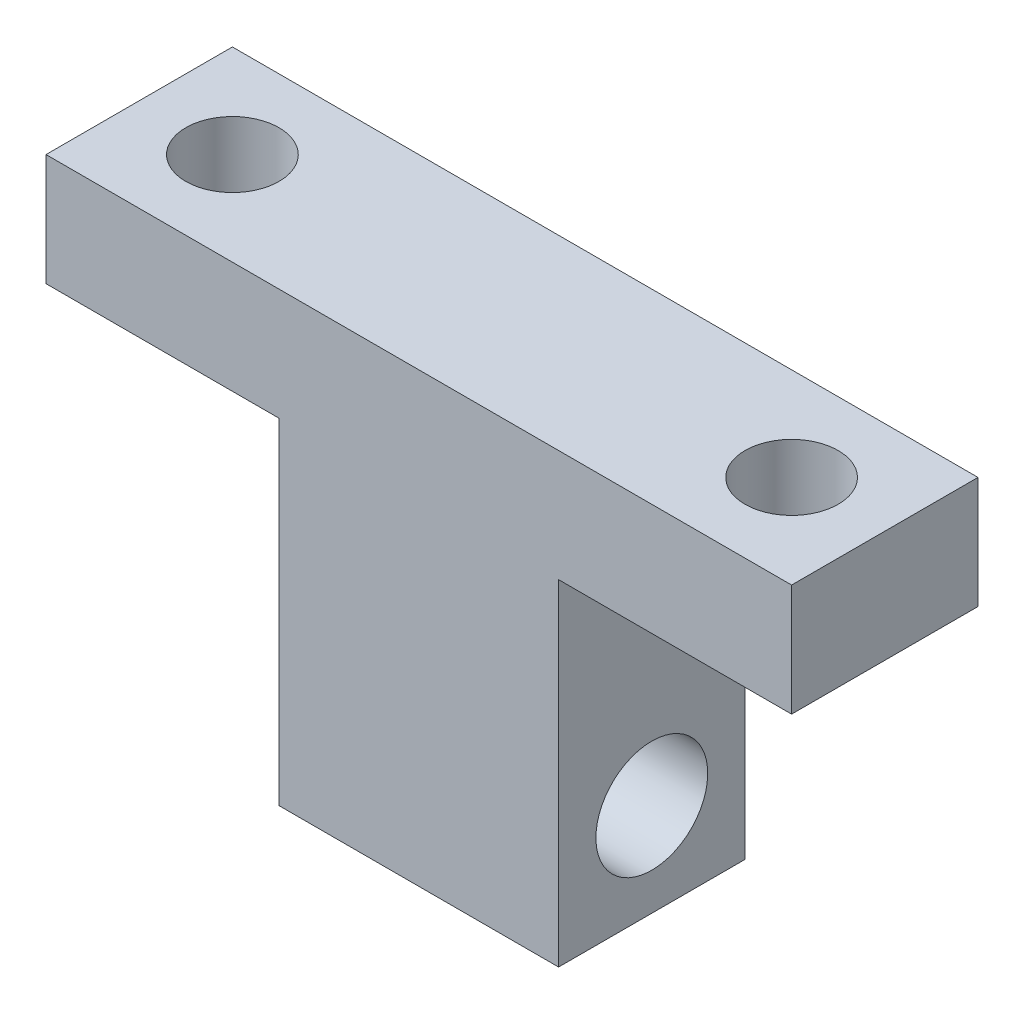
ISO-10303-21;
HEADER;
FILE_DESCRIPTION(('STEP AP214'),'2;1');
FILE_NAME('part.step','',(''),(''),'','','');
FILE_SCHEMA(('AUTOMOTIVE_DESIGN { 1 0 10303 214 1 1 1 1 }'));
ENDSEC;
DATA;
#1=APPLICATION_CONTEXT('core data for automotive mechanical design processes');
#2=APPLICATION_PROTOCOL_DEFINITION('international standard','automotive_design',2000,#1);
#3=PRODUCT_CONTEXT('',#1,'mechanical');
#4=PRODUCT('Part','Part','',(#3));
#5=PRODUCT_RELATED_PRODUCT_CATEGORY('part','',(#4));
#6=PRODUCT_DEFINITION_FORMATION('','',#4);
#7=PRODUCT_DEFINITION_CONTEXT('part definition',#1,'design');
#8=PRODUCT_DEFINITION('design','',#6,#7);
#9=PRODUCT_DEFINITION_SHAPE('','',#8);
#10=(LENGTH_UNIT() NAMED_UNIT(*) SI_UNIT(.MILLI.,.METRE.));
#11=(NAMED_UNIT(*) PLANE_ANGLE_UNIT() SI_UNIT($,.RADIAN.));
#12=(NAMED_UNIT(*) SI_UNIT($,.STERADIAN.) SOLID_ANGLE_UNIT());
#13=UNCERTAINTY_MEASURE_WITH_UNIT(LENGTH_MEASURE(1.E-05),#10,'distance_accuracy_value','');
#14=(GEOMETRIC_REPRESENTATION_CONTEXT(3) GLOBAL_UNCERTAINTY_ASSIGNED_CONTEXT((#13)) GLOBAL_UNIT_ASSIGNED_CONTEXT((#10,
#11,#12)) REPRESENTATION_CONTEXT('',''));
#15=CARTESIAN_POINT('',(0.,0.,0.));
#16=DIRECTION('',(0.,0.,1.));
#17=DIRECTION('',(1.,0.,0.));
#18=AXIS2_PLACEMENT_3D('',#15,#16,#17);
#19=CARTESIAN_POINT('',(-20.,-6.,-10.));
#20=DIRECTION('',(1.,0.,0.));
#21=DIRECTION('',(0.,1.,0.));
#22=AXIS2_PLACEMENT_3D('',#19,#20,#21);
#23=PLANE('',#22);
#24=DIRECTION('',(0.,-1.,0.));
#25=VECTOR('',#24,1.);
#26=CARTESIAN_POINT('',(-20.,-6.,0.));
#27=LINE('',#26,#25);
#28=CARTESIAN_POINT('',(-20.,0.,0.));
#29=VERTEX_POINT('',#28);
#30=CARTESIAN_POINT('',(-20.,-6.,0.));
#31=VERTEX_POINT('',#30);
#32=EDGE_CURVE('E133',#29,#31,#27,.T.);
#33=ORIENTED_EDGE('',*,*,#32,.F.);
#34=DIRECTION('',(0.,0.,1.));
#35=VECTOR('',#34,1.);
#36=CARTESIAN_POINT('',(-20.,0.,-10.));
#37=LINE('',#36,#35);
#38=CARTESIAN_POINT('',(-20.,0.,-10.));
#39=VERTEX_POINT('',#38);
#40=EDGE_CURVE('E132',#39,#29,#37,.T.);
#41=ORIENTED_EDGE('',*,*,#40,.F.);
#42=DIRECTION('',(0.,-1.,0.));
#43=VECTOR('',#42,1.);
#44=CARTESIAN_POINT('',(-20.,-6.,-10.));
#45=LINE('',#44,#43);
#46=CARTESIAN_POINT('',(-20.,-6.,-10.));
#47=VERTEX_POINT('',#46);
#48=EDGE_CURVE('E152',#39,#47,#45,.T.);
#49=ORIENTED_EDGE('',*,*,#48,.T.);
#50=DIRECTION('',(0.,0.,1.));
#51=VECTOR('',#50,1.);
#52=CARTESIAN_POINT('',(-20.,-6.,-10.));
#53=LINE('',#52,#51);
#54=EDGE_CURVE('E11',#47,#31,#53,.T.);
#55=ORIENTED_EDGE('',*,*,#54,.T.);
#56=EDGE_LOOP('',(#33,#41,#49,#55));
#57=FACE_BOUND('',#56,.T.);
#58=ADVANCED_FACE('F37',(#57),#23,.F.);
#59=CARTESIAN_POINT('',(-7.5,-6.,-10.));
#60=DIRECTION('',(0.,1.,0.));
#61=DIRECTION('',(-1.,0.,0.));
#62=AXIS2_PLACEMENT_3D('',#59,#60,#61);
#63=PLANE('',#62);
#64=CARTESIAN_POINT('',(-15.,-6.,-5.));
#65=DIRECTION('',(0.,-1.,0.));
#66=DIRECTION('',(0.,0.,1.));
#67=AXIS2_PLACEMENT_3D('',#64,#65,#66);
#68=CIRCLE('',#67,2.5);
#69=CARTESIAN_POINT('',(-15.,-6.,-2.5));
#70=VERTEX_POINT('',#69);
#71=EDGE_CURVE('E306',#70,#70,#68,.T.);
#72=ORIENTED_EDGE('',*,*,#71,.F.);
#73=EDGE_LOOP('',(#72));
#74=FACE_BOUND('',#73,.T.);
#75=DIRECTION('',(1.,0.,0.));
#76=VECTOR('',#75,1.);
#77=CARTESIAN_POINT('',(-7.5,-6.,0.));
#78=LINE('',#77,#76);
#79=CARTESIAN_POINT('',(-7.5,-6.,0.));
#80=VERTEX_POINT('',#79);
#81=EDGE_CURVE('E135',#31,#80,#78,.T.);
#82=ORIENTED_EDGE('',*,*,#81,.F.);
#83=ORIENTED_EDGE('',*,*,#54,.F.);
#84=DIRECTION('',(1.,0.,0.));
#85=VECTOR('',#84,1.);
#86=CARTESIAN_POINT('',(-7.5,-6.,-10.));
#87=LINE('',#86,#85);
#88=CARTESIAN_POINT('',(-7.5,-6.,-10.));
#89=VERTEX_POINT('',#88);
#90=EDGE_CURVE('E91',#47,#89,#87,.T.);
#91=ORIENTED_EDGE('',*,*,#90,.T.);
#92=DIRECTION('',(0.,0.,1.));
#93=VECTOR('',#92,1.);
#94=CARTESIAN_POINT('',(-7.5,-6.,-10.));
#95=LINE('',#94,#93);
#96=EDGE_CURVE('E45',#89,#80,#95,.T.);
#97=ORIENTED_EDGE('',*,*,#96,.T.);
#98=EDGE_LOOP('',(#82,#83,#91,#97));
#99=FACE_BOUND('',#98,.T.);
#100=ADVANCED_FACE('F164',(#74,#99),#63,.F.);
#101=CARTESIAN_POINT('',(-7.5,-24.,-10.));
#102=DIRECTION('',(1.,0.,0.));
#103=DIRECTION('',(0.,1.,0.));
#104=AXIS2_PLACEMENT_3D('',#101,#102,#103);
#105=PLANE('',#104);
#106=CARTESIAN_POINT('',(-7.5,-19.,-5.));
#107=DIRECTION('',(-1.,0.,0.));
#108=DIRECTION('',(0.,1.,0.));
#109=AXIS2_PLACEMENT_3D('',#106,#107,#108);
#110=CIRCLE('',#109,3.);
#111=CARTESIAN_POINT('',(-7.5,-16.,-5.));
#112=VERTEX_POINT('',#111);
#113=EDGE_CURVE('E305',#112,#112,#110,.T.);
#114=ORIENTED_EDGE('',*,*,#113,.F.);
#115=EDGE_LOOP('',(#114));
#116=FACE_BOUND('',#115,.T.);
#117=DIRECTION('',(0.,-1.,0.));
#118=VECTOR('',#117,1.);
#119=CARTESIAN_POINT('',(-7.5,-24.,0.));
#120=LINE('',#119,#118);
#121=CARTESIAN_POINT('',(-7.5,-24.,0.));
#122=VERTEX_POINT('',#121);
#123=EDGE_CURVE('E139',#80,#122,#120,.T.);
#124=ORIENTED_EDGE('',*,*,#123,.F.);
#125=ORIENTED_EDGE('',*,*,#96,.F.);
#126=DIRECTION('',(0.,-1.,0.));
#127=VECTOR('',#126,1.);
#128=CARTESIAN_POINT('',(-7.5,-24.,-10.));
#129=LINE('',#128,#127);
#130=CARTESIAN_POINT('',(-7.5,-24.,-10.));
#131=VERTEX_POINT('',#130);
#132=EDGE_CURVE('E173',#89,#131,#129,.T.);
#133=ORIENTED_EDGE('',*,*,#132,.T.);
#134=DIRECTION('',(0.,0.,1.));
#135=VECTOR('',#134,1.);
#136=CARTESIAN_POINT('',(-7.5,-24.,-10.));
#137=LINE('',#136,#135);
#138=EDGE_CURVE('E159',#131,#122,#137,.T.);
#139=ORIENTED_EDGE('',*,*,#138,.T.);
#140=EDGE_LOOP('',(#124,#125,#133,#139));
#141=FACE_BOUND('',#140,.T.);
#142=ADVANCED_FACE('F186',(#116,#141),#105,.F.);
#143=CARTESIAN_POINT('',(7.5,-24.,-10.));
#144=DIRECTION('',(0.,1.,0.));
#145=DIRECTION('',(-1.,0.,0.));
#146=AXIS2_PLACEMENT_3D('',#143,#144,#145);
#147=PLANE('',#146);
#148=DIRECTION('',(1.,0.,0.));
#149=VECTOR('',#148,1.);
#150=CARTESIAN_POINT('',(7.5,-24.,0.));
#151=LINE('',#150,#149);
#152=CARTESIAN_POINT('',(7.5,-24.,0.));
#153=VERTEX_POINT('',#152);
#154=EDGE_CURVE('E142',#122,#153,#151,.T.);
#155=ORIENTED_EDGE('',*,*,#154,.F.);
#156=ORIENTED_EDGE('',*,*,#138,.F.);
#157=DIRECTION('',(1.,0.,0.));
#158=VECTOR('',#157,1.);
#159=CARTESIAN_POINT('',(7.5,-24.,-10.));
#160=LINE('',#159,#158);
#161=CARTESIAN_POINT('',(7.5,-24.,-10.));
#162=VERTEX_POINT('',#161);
#163=EDGE_CURVE('E127',#131,#162,#160,.T.);
#164=ORIENTED_EDGE('',*,*,#163,.T.);
#165=DIRECTION('',(0.,0.,1.));
#166=VECTOR('',#165,1.);
#167=CARTESIAN_POINT('',(7.5,-24.,-10.));
#168=LINE('',#167,#166);
#169=EDGE_CURVE('E156',#162,#153,#168,.T.);
#170=ORIENTED_EDGE('',*,*,#169,.T.);
#171=EDGE_LOOP('',(#155,#156,#164,#170));
#172=FACE_BOUND('',#171,.T.);
#173=ADVANCED_FACE('F182',(#172),#147,.F.);
#174=CARTESIAN_POINT('',(7.5,-6.,-10.));
#175=DIRECTION('',(-1.,0.,0.));
#176=DIRECTION('',(0.,-1.,0.));
#177=AXIS2_PLACEMENT_3D('',#174,#175,#176);
#178=PLANE('',#177);
#179=CARTESIAN_POINT('',(7.5,-19.,-5.));
#180=DIRECTION('',(-1.,0.,0.));
#181=DIRECTION('',(0.,1.,0.));
#182=AXIS2_PLACEMENT_3D('',#179,#180,#181);
#183=CIRCLE('',#182,3.);
#184=CARTESIAN_POINT('',(7.5,-16.,-5.));
#185=VERTEX_POINT('',#184);
#186=EDGE_CURVE('E303',#185,#185,#183,.T.);
#187=ORIENTED_EDGE('',*,*,#186,.T.);
#188=EDGE_LOOP('',(#187));
#189=FACE_BOUND('',#188,.T.);
#190=DIRECTION('',(0.,1.,0.));
#191=VECTOR('',#190,1.);
#192=CARTESIAN_POINT('',(7.5,-6.,0.));
#193=LINE('',#192,#191);
#194=CARTESIAN_POINT('',(7.5,-6.,0.));
#195=VERTEX_POINT('',#194);
#196=EDGE_CURVE('E145',#153,#195,#193,.T.);
#197=ORIENTED_EDGE('',*,*,#196,.F.);
#198=ORIENTED_EDGE('',*,*,#169,.F.);
#199=DIRECTION('',(0.,1.,0.));
#200=VECTOR('',#199,1.);
#201=CARTESIAN_POINT('',(7.5,-6.,-10.));
#202=LINE('',#201,#200);
#203=CARTESIAN_POINT('',(7.5,-6.,-10.));
#204=VERTEX_POINT('',#203);
#205=EDGE_CURVE('E125',#162,#204,#202,.T.);
#206=ORIENTED_EDGE('',*,*,#205,.T.);
#207=DIRECTION('',(0.,0.,1.));
#208=VECTOR('',#207,1.);
#209=CARTESIAN_POINT('',(7.5,-6.,-10.));
#210=LINE('',#209,#208);
#211=EDGE_CURVE('E119',#204,#195,#210,.T.);
#212=ORIENTED_EDGE('',*,*,#211,.T.);
#213=EDGE_LOOP('',(#197,#198,#206,#212));
#214=FACE_BOUND('',#213,.T.);
#215=ADVANCED_FACE('F185',(#189,#214),#178,.F.);
#216=CARTESIAN_POINT('',(20.,-5.99999999999999,-10.));
#217=DIRECTION('',(0.,1.,0.));
#218=DIRECTION('',(-1.,0.,0.));
#219=AXIS2_PLACEMENT_3D('',#216,#217,#218);
#220=PLANE('',#219);
#221=CARTESIAN_POINT('',(15.,-6.,-5.));
#222=DIRECTION('',(0.,1.,0.));
#223=DIRECTION('',(0.,0.,1.));
#224=AXIS2_PLACEMENT_3D('',#221,#222,#223);
#225=CIRCLE('',#224,2.5);
#226=CARTESIAN_POINT('',(15.,-6.,-2.5));
#227=VERTEX_POINT('',#226);
#228=EDGE_CURVE('E176',#227,#227,#225,.T.);
#229=ORIENTED_EDGE('',*,*,#228,.T.);
#230=EDGE_LOOP('',(#229));
#231=FACE_BOUND('',#230,.T.);
#232=DIRECTION('',(1.,0.,0.));
#233=VECTOR('',#232,1.);
#234=CARTESIAN_POINT('',(20.,-5.99999999999999,0.));
#235=LINE('',#234,#233);
#236=CARTESIAN_POINT('',(20.,-5.99999999999999,0.));
#237=VERTEX_POINT('',#236);
#238=EDGE_CURVE('E148',#195,#237,#235,.T.);
#239=ORIENTED_EDGE('',*,*,#238,.F.);
#240=ORIENTED_EDGE('',*,*,#211,.F.);
#241=DIRECTION('',(1.,0.,0.));
#242=VECTOR('',#241,1.);
#243=CARTESIAN_POINT('',(20.,-5.99999999999999,-10.));
#244=LINE('',#243,#242);
#245=CARTESIAN_POINT('',(20.,-5.99999999999999,-10.));
#246=VERTEX_POINT('',#245);
#247=EDGE_CURVE('E109',#204,#246,#244,.T.);
#248=ORIENTED_EDGE('',*,*,#247,.T.);
#249=DIRECTION('',(0.,0.,1.));
#250=VECTOR('',#249,1.);
#251=CARTESIAN_POINT('',(20.,-5.99999999999999,-10.));
#252=LINE('',#251,#250);
#253=EDGE_CURVE('E114',#246,#237,#252,.T.);
#254=ORIENTED_EDGE('',*,*,#253,.T.);
#255=EDGE_LOOP('',(#239,#240,#248,#254));
#256=FACE_BOUND('',#255,.T.);
#257=ADVANCED_FACE('F122',(#231,#256),#220,.F.);
#258=CARTESIAN_POINT('',(20.,0.,-10.));
#259=DIRECTION('',(-1.,0.,0.));
#260=DIRECTION('',(0.,-1.,0.));
#261=AXIS2_PLACEMENT_3D('',#258,#259,#260);
#262=PLANE('',#261);
#263=DIRECTION('',(0.,1.,0.));
#264=VECTOR('',#263,1.);
#265=CARTESIAN_POINT('',(20.,0.,0.));
#266=LINE('',#265,#264);
#267=CARTESIAN_POINT('',(20.,0.,0.));
#268=VERTEX_POINT('',#267);
#269=EDGE_CURVE('E116',#237,#268,#266,.T.);
#270=ORIENTED_EDGE('',*,*,#269,.F.);
#271=ORIENTED_EDGE('',*,*,#253,.F.);
#272=DIRECTION('',(0.,1.,0.));
#273=VECTOR('',#272,1.);
#274=CARTESIAN_POINT('',(20.,0.,-10.));
#275=LINE('',#274,#273);
#276=CARTESIAN_POINT('',(20.,0.,-10.));
#277=VERTEX_POINT('',#276);
#278=EDGE_CURVE('E105',#246,#277,#275,.T.);
#279=ORIENTED_EDGE('',*,*,#278,.T.);
#280=DIRECTION('',(0.,0.,1.));
#281=VECTOR('',#280,1.);
#282=CARTESIAN_POINT('',(20.,0.,-10.));
#283=LINE('',#282,#281);
#284=EDGE_CURVE('E120',#277,#268,#283,.T.);
#285=ORIENTED_EDGE('',*,*,#284,.T.);
#286=EDGE_LOOP('',(#270,#271,#279,#285));
#287=FACE_BOUND('',#286,.T.);
#288=ADVANCED_FACE('F115',(#287),#262,.F.);
#289=CARTESIAN_POINT('',(-20.,0.,-10.));
#290=DIRECTION('',(0.,-1.,0.));
#291=DIRECTION('',(1.,0.,0.));
#292=AXIS2_PLACEMENT_3D('',#289,#290,#291);
#293=PLANE('',#292);
#294=CARTESIAN_POINT('',(-15.,0.,-5.));
#295=DIRECTION('',(0.,-1.,0.));
#296=DIRECTION('',(0.,0.,1.));
#297=AXIS2_PLACEMENT_3D('',#294,#295,#296);
#298=CIRCLE('',#297,2.5);
#299=CARTESIAN_POINT('',(-15.,0.,-2.5));
#300=VERTEX_POINT('',#299);
#301=EDGE_CURVE('E309',#300,#300,#298,.T.);
#302=ORIENTED_EDGE('',*,*,#301,.T.);
#303=EDGE_LOOP('',(#302));
#304=FACE_BOUND('',#303,.T.);
#305=CARTESIAN_POINT('',(15.,0.,-5.));
#306=DIRECTION('',(0.,1.,0.));
#307=DIRECTION('',(0.,0.,1.));
#308=AXIS2_PLACEMENT_3D('',#305,#306,#307);
#309=CIRCLE('',#308,2.5);
#310=CARTESIAN_POINT('',(15.,0.,-2.5));
#311=VERTEX_POINT('',#310);
#312=EDGE_CURVE('E136',#311,#311,#309,.T.);
#313=ORIENTED_EDGE('',*,*,#312,.F.);
#314=EDGE_LOOP('',(#313));
#315=FACE_BOUND('',#314,.T.);
#316=DIRECTION('',(-1.,0.,0.));
#317=VECTOR('',#316,1.);
#318=CARTESIAN_POINT('',(-20.,0.,0.));
#319=LINE('',#318,#317);
#320=EDGE_CURVE('E79',#268,#29,#319,.T.);
#321=ORIENTED_EDGE('',*,*,#320,.F.);
#322=ORIENTED_EDGE('',*,*,#284,.F.);
#323=DIRECTION('',(-1.,0.,0.));
#324=VECTOR('',#323,1.);
#325=CARTESIAN_POINT('',(-20.,0.,-10.));
#326=LINE('',#325,#324);
#327=EDGE_CURVE('E53',#277,#39,#326,.T.);
#328=ORIENTED_EDGE('',*,*,#327,.T.);
#329=ORIENTED_EDGE('',*,*,#40,.T.);
#330=EDGE_LOOP('',(#321,#322,#328,#329));
#331=FACE_BOUND('',#330,.T.);
#332=ADVANCED_FACE('F241',(#304,#315,#331),#293,.F.);
#333=CARTESIAN_POINT('',(0.,0.,-10.));
#334=DIRECTION('',(0.,0.,1.));
#335=DIRECTION('',(-1.,0.,0.));
#336=AXIS2_PLACEMENT_3D('',#333,#334,#335);
#337=PLANE('',#336);
#338=ORIENTED_EDGE('',*,*,#48,.F.);
#339=ORIENTED_EDGE('',*,*,#327,.F.);
#340=ORIENTED_EDGE('',*,*,#278,.F.);
#341=ORIENTED_EDGE('',*,*,#247,.F.);
#342=ORIENTED_EDGE('',*,*,#205,.F.);
#343=ORIENTED_EDGE('',*,*,#163,.F.);
#344=ORIENTED_EDGE('',*,*,#132,.F.);
#345=ORIENTED_EDGE('',*,*,#90,.F.);
#346=EDGE_LOOP('',(#338,#339,#340,#341,#342,#343,#344,#345));
#347=FACE_BOUND('',#346,.T.);
#348=ADVANCED_FACE('F107',(#347),#337,.F.);
#349=CARTESIAN_POINT('',(0.,0.,0.));
#350=DIRECTION('',(0.,0.,1.));
#351=DIRECTION('',(-1.,0.,0.));
#352=AXIS2_PLACEMENT_3D('',#349,#350,#351);
#353=PLANE('',#352);
#354=ORIENTED_EDGE('',*,*,#32,.T.);
#355=ORIENTED_EDGE('',*,*,#81,.T.);
#356=ORIENTED_EDGE('',*,*,#123,.T.);
#357=ORIENTED_EDGE('',*,*,#154,.T.);
#358=ORIENTED_EDGE('',*,*,#196,.T.);
#359=ORIENTED_EDGE('',*,*,#238,.T.);
#360=ORIENTED_EDGE('',*,*,#269,.T.);
#361=ORIENTED_EDGE('',*,*,#320,.T.);
#362=EDGE_LOOP('',(#354,#355,#356,#357,#358,#359,#360,#361));
#363=FACE_BOUND('',#362,.T.);
#364=ADVANCED_FACE('F167',(#363),#353,.T.);
#365=CARTESIAN_POINT('',(15.,0.,-5.));
#366=DIRECTION('',(0.,-1.,0.));
#367=DIRECTION('',(0.,0.,1.));
#368=AXIS2_PLACEMENT_3D('',#365,#366,#367);
#369=CYLINDRICAL_SURFACE('',#368,2.5);
#370=ORIENTED_EDGE('',*,*,#312,.T.);
#371=EDGE_LOOP('',(#370));
#372=FACE_BOUND('',#371,.T.);
#373=ORIENTED_EDGE('',*,*,#228,.F.);
#374=EDGE_LOOP('',(#373));
#375=FACE_BOUND('',#374,.T.);
#376=ADVANCED_FACE('F267',(#372,#375),#369,.F.);
#377=CARTESIAN_POINT('',(-15.,0.,-5.));
#378=DIRECTION('',(0.,-1.,0.));
#379=DIRECTION('',(0.,0.,1.));
#380=AXIS2_PLACEMENT_3D('',#377,#378,#379);
#381=CYLINDRICAL_SURFACE('',#380,2.5);
#382=ORIENTED_EDGE('',*,*,#301,.F.);
#383=EDGE_LOOP('',(#382));
#384=FACE_BOUND('',#383,.T.);
#385=ORIENTED_EDGE('',*,*,#71,.T.);
#386=EDGE_LOOP('',(#385));
#387=FACE_BOUND('',#386,.T.);
#388=ADVANCED_FACE('F276',(#384,#387),#381,.F.);
#389=CARTESIAN_POINT('',(-20.,-19.,-5.));
#390=DIRECTION('',(1.,0.,0.));
#391=DIRECTION('',(0.,1.,0.));
#392=AXIS2_PLACEMENT_3D('',#389,#390,#391);
#393=CYLINDRICAL_SURFACE('',#392,3.);
#394=ORIENTED_EDGE('',*,*,#186,.F.);
#395=EDGE_LOOP('',(#394));
#396=FACE_BOUND('',#395,.T.);
#397=ORIENTED_EDGE('',*,*,#113,.T.);
#398=EDGE_LOOP('',(#397));
#399=FACE_BOUND('',#398,.T.);
#400=ADVANCED_FACE('F286',(#396,#399),#393,.F.);
#401=CLOSED_SHELL('',(#58,#100,#142,#173,#215,#257,#288,#332,#348,#364,#376,#388,#400));
#402=MANIFOLD_SOLID_BREP('B2',#401);
#403=ADVANCED_BREP_SHAPE_REPRESENTATION('',(#18,#402),#14);
#404=SHAPE_DEFINITION_REPRESENTATION(#9,#403);
ENDSEC;
END-ISO-10303-21;
